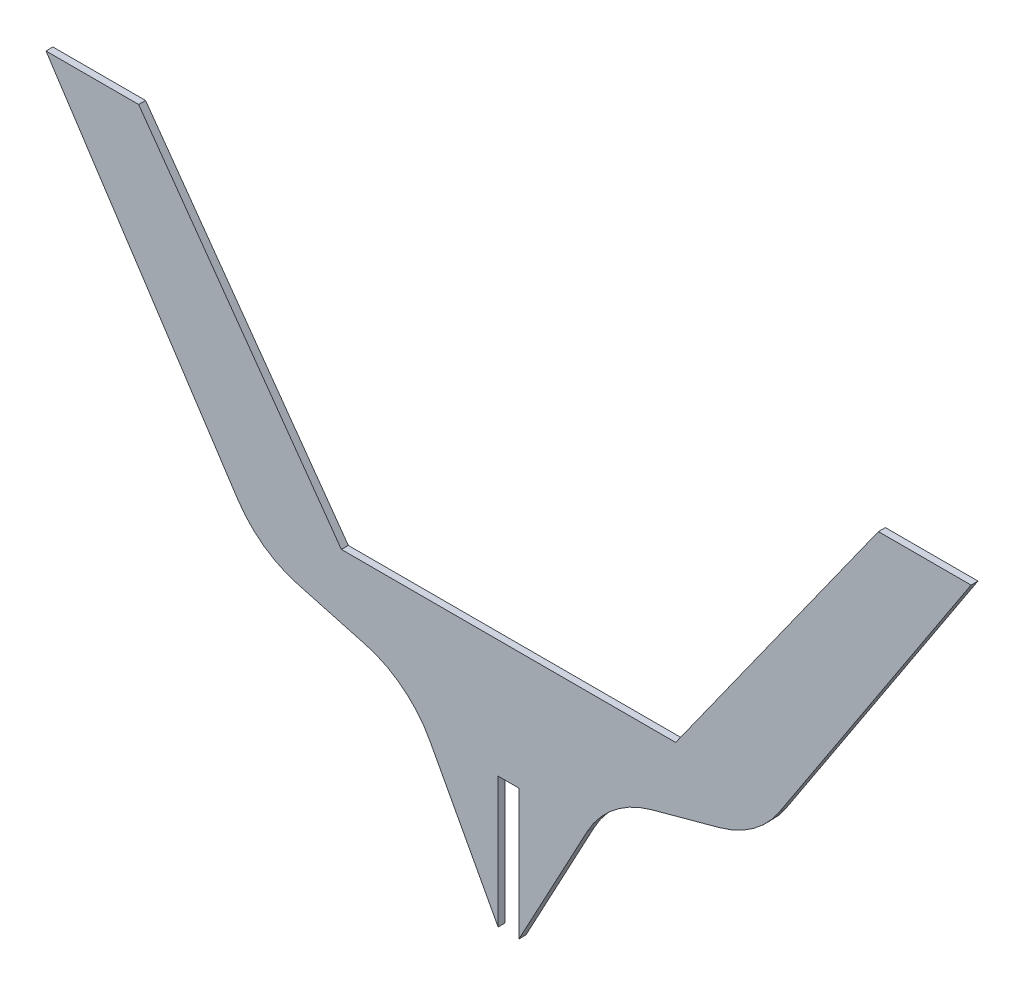
ISO-10303-21;
HEADER;
FILE_DESCRIPTION(('STEP AP214'),'2;1');
FILE_NAME('part.step','',(''),(''),'','','');
FILE_SCHEMA(('AUTOMOTIVE_DESIGN { 1 0 10303 214 1 1 1 1 }'));
ENDSEC;
DATA;
#1=APPLICATION_CONTEXT('core data for automotive mechanical design processes');
#2=APPLICATION_PROTOCOL_DEFINITION('international standard','automotive_design',2000,#1);
#3=PRODUCT_CONTEXT('',#1,'mechanical');
#4=PRODUCT('Part','Part','',(#3));
#5=PRODUCT_RELATED_PRODUCT_CATEGORY('part','',(#4));
#6=PRODUCT_DEFINITION_FORMATION('','',#4);
#7=PRODUCT_DEFINITION_CONTEXT('part definition',#1,'design');
#8=PRODUCT_DEFINITION('design','',#6,#7);
#9=PRODUCT_DEFINITION_SHAPE('','',#8);
#10=(LENGTH_UNIT() NAMED_UNIT(*) SI_UNIT(.MILLI.,.METRE.));
#11=(NAMED_UNIT(*) PLANE_ANGLE_UNIT() SI_UNIT($,.RADIAN.));
#12=(NAMED_UNIT(*) SI_UNIT($,.STERADIAN.) SOLID_ANGLE_UNIT());
#13=UNCERTAINTY_MEASURE_WITH_UNIT(LENGTH_MEASURE(1.E-05),#10,'distance_accuracy_value','');
#14=(GEOMETRIC_REPRESENTATION_CONTEXT(3) GLOBAL_UNCERTAINTY_ASSIGNED_CONTEXT((#13)) GLOBAL_UNIT_ASSIGNED_CONTEXT((#10,
#11,#12)) REPRESENTATION_CONTEXT('',''));
#15=CARTESIAN_POINT('',(0.,0.,0.));
#16=DIRECTION('',(0.,0.,1.));
#17=DIRECTION('',(1.,0.,0.));
#18=AXIS2_PLACEMENT_3D('',#15,#16,#17);
#19=CARTESIAN_POINT('',(209.958428132629,-278.078138889041,3.));
#20=DIRECTION('',(1.,0.,0.));
#21=DIRECTION('',(0.,1.,0.));
#22=AXIS2_PLACEMENT_3D('',#19,#20,#21);
#23=PLANE('',#22);
#24=DIRECTION('',(0.,-1.,0.));
#25=VECTOR('',#24,1.);
#26=CARTESIAN_POINT('',(209.958428132629,-278.078138889041,0.));
#27=LINE('',#26,#25);
#28=CARTESIAN_POINT('',(209.958428132629,-221.578138889041,0.));
#29=VERTEX_POINT('',#28);
#30=CARTESIAN_POINT('',(209.958428132629,-278.078138889041,0.));
#31=VERTEX_POINT('',#30);
#32=EDGE_CURVE('E184',#29,#31,#27,.T.);
#33=ORIENTED_EDGE('',*,*,#32,.T.);
#34=DIRECTION('',(0.,0.,-1.));
#35=VECTOR('',#34,1.);
#36=CARTESIAN_POINT('',(209.958428132629,-278.078138889041,3.));
#37=LINE('',#36,#35);
#38=CARTESIAN_POINT('',(209.958428132629,-278.078138889041,3.));
#39=VERTEX_POINT('',#38);
#40=EDGE_CURVE('E165',#39,#31,#37,.T.);
#41=ORIENTED_EDGE('',*,*,#40,.F.);
#42=DIRECTION('',(0.,-1.,0.));
#43=VECTOR('',#42,1.);
#44=CARTESIAN_POINT('',(209.958428132629,-278.078138889041,3.));
#45=LINE('',#44,#43);
#46=CARTESIAN_POINT('',(209.958428132629,-221.578138889041,3.));
#47=VERTEX_POINT('',#46);
#48=EDGE_CURVE('E171',#47,#39,#45,.T.);
#49=ORIENTED_EDGE('',*,*,#48,.F.);
#50=DIRECTION('',(0.,0.,-1.));
#51=VECTOR('',#50,1.);
#52=CARTESIAN_POINT('',(209.958428132629,-221.578138889041,3.));
#53=LINE('',#52,#51);
#54=EDGE_CURVE('E252',#47,#29,#53,.T.);
#55=ORIENTED_EDGE('',*,*,#54,.T.);
#56=EDGE_LOOP('',(#33,#41,#49,#55));
#57=FACE_BOUND('',#56,.T.);
#58=ADVANCED_FACE('F35',(#57),#23,.F.);
#59=CARTESIAN_POINT('',(248.604786317527,-206.078138889041,3.));
#60=DIRECTION('',(-0.881097998636577,0.472933734045922,0.));
#61=DIRECTION('',(-0.472933734045922,-0.881097998636577,0.));
#62=AXIS2_PLACEMENT_3D('',#59,#60,#61);
#63=PLANE('',#62);
#64=DIRECTION('',(0.472933734045922,0.881097998636577,0.));
#65=VECTOR('',#64,1.);
#66=CARTESIAN_POINT('',(248.604786317527,-206.078138889041,0.));
#67=LINE('',#66,#65);
#68=CARTESIAN_POINT('',(239.44792025117,-223.13781508475,0.));
#69=VERTEX_POINT('',#68);
#70=EDGE_CURVE('E254',#31,#69,#67,.T.);
#71=ORIENTED_EDGE('',*,*,#70,.T.);
#72=DIRECTION('',(0.,0.,-1.));
#73=VECTOR('',#72,1.);
#74=CARTESIAN_POINT('',(239.44792025117,-223.13781508475,3.));
#75=LINE('',#74,#73);
#76=CARTESIAN_POINT('',(239.44792025117,-223.13781508475,3.));
#77=VERTEX_POINT('',#76);
#78=EDGE_CURVE('E168',#69,#77,#75,.F.);
#79=ORIENTED_EDGE('',*,*,#78,.T.);
#80=DIRECTION('',(0.472933734045922,0.881097998636577,0.));
#81=VECTOR('',#80,1.);
#82=CARTESIAN_POINT('',(248.604786317527,-206.078138889041,3.));
#83=LINE('',#82,#81);
#84=EDGE_CURVE('E160',#39,#77,#83,.T.);
#85=ORIENTED_EDGE('',*,*,#84,.F.);
#86=ORIENTED_EDGE('',*,*,#40,.T.);
#87=EDGE_LOOP('',(#71,#79,#85,#86));
#88=FACE_BOUND('',#87,.T.);
#89=ADVANCED_FACE('F163',(#88),#63,.F.);
#90=CARTESIAN_POINT('',(313.167585376123,-188.519568080122,3.));
#91=DIRECTION('',(-0.262429216507242,0.964951245568083,0.));
#92=DIRECTION('',(-0.964951245568083,-0.262429216507242,0.));
#93=AXIS2_PLACEMENT_3D('',#90,#91,#92);
#94=PLANE('',#93);
#95=DIRECTION('',(0.964951245568083,0.262429216507242,0.));
#96=VECTOR('',#95,1.);
#97=CARTESIAN_POINT('',(313.167585376123,-188.519568080122,0.));
#98=LINE('',#97,#96);
#99=CARTESIAN_POINT('',(267.28801544699,-200.997027066253,0.));
#100=VERTEX_POINT('',#99);
#101=CARTESIAN_POINT('',(296.702726457189,-192.997369467335,0.));
#102=VERTEX_POINT('',#101);
#103=EDGE_CURVE('E256',#100,#102,#98,.T.);
#104=ORIENTED_EDGE('',*,*,#103,.T.);
#105=DIRECTION('',(0.,0.,-1.));
#106=VECTOR('',#105,1.);
#107=CARTESIAN_POINT('',(296.702726457189,-192.997369467335,3.));
#108=LINE('',#107,#106);
#109=CARTESIAN_POINT('',(296.702726457189,-192.997369467335,3.));
#110=VERTEX_POINT('',#109);
#111=EDGE_CURVE('E202',#102,#110,#108,.F.);
#112=ORIENTED_EDGE('',*,*,#111,.T.);
#113=DIRECTION('',(0.964951245568083,0.262429216507242,0.));
#114=VECTOR('',#113,1.);
#115=CARTESIAN_POINT('',(313.167585376123,-188.519568080122,3.));
#116=LINE('',#115,#114);
#117=CARTESIAN_POINT('',(267.28801544699,-200.997027066253,3.));
#118=VERTEX_POINT('',#117);
#119=EDGE_CURVE('E170',#118,#110,#116,.T.);
#120=ORIENTED_EDGE('',*,*,#119,.F.);
#121=DIRECTION('',(0.,0.,-1.));
#122=VECTOR('',#121,1.);
#123=CARTESIAN_POINT('',(267.28801544699,-200.997027066253,0.));
#124=LINE('',#123,#122);
#125=EDGE_CURVE('E199',#118,#100,#124,.T.);
#126=ORIENTED_EDGE('',*,*,#125,.T.);
#127=EDGE_LOOP('',(#104,#112,#120,#126));
#128=FACE_BOUND('',#127,.T.);
#129=ADVANCED_FACE('F347',(#128),#94,.F.);
#130=CARTESIAN_POINT('',(405.458428132629,-47.7781388890407,3.));
#131=DIRECTION('',(-0.836240604688809,0.548362700290323,0.));
#132=DIRECTION('',(-0.548362700290323,-0.836240604688809,0.));
#133=AXIS2_PLACEMENT_3D('',#130,#131,#132);
#134=PLANE('',#133);
#135=DIRECTION('',(0.548362700290323,0.836240604688809,0.));
#136=VECTOR('',#135,1.);
#137=CARTESIAN_POINT('',(405.458428132629,-47.7781388890407,3.));
#138=LINE('',#137,#136);
#139=CARTESIAN_POINT('',(322.52423892536,-174.250884929836,3.));
#140=VERTEX_POINT('',#139);
#141=CARTESIAN_POINT('',(405.458428132629,-47.7781388890407,3.));
#142=VERTEX_POINT('',#141);
#143=EDGE_CURVE('E508',#140,#142,#138,.T.);
#144=ORIENTED_EDGE('',*,*,#143,.F.);
#145=DIRECTION('',(0.,0.,-1.));
#146=VECTOR('',#145,1.);
#147=CARTESIAN_POINT('',(322.52423892536,-174.250884929836,3.));
#148=LINE('',#147,#146);
#149=CARTESIAN_POINT('',(322.52423892536,-174.250884929836,0.));
#150=VERTEX_POINT('',#149);
#151=EDGE_CURVE('E185',#140,#150,#148,.T.);
#152=ORIENTED_EDGE('',*,*,#151,.T.);
#153=DIRECTION('',(0.548362700290323,0.836240604688809,0.));
#154=VECTOR('',#153,1.);
#155=CARTESIAN_POINT('',(405.458428132629,-47.7781388890407,0.));
#156=LINE('',#155,#154);
#157=CARTESIAN_POINT('',(405.458428132629,-47.7781388890407,0.));
#158=VERTEX_POINT('',#157);
#159=EDGE_CURVE('E259',#150,#158,#156,.T.);
#160=ORIENTED_EDGE('',*,*,#159,.T.);
#161=DIRECTION('',(0.,0.,-1.));
#162=VECTOR('',#161,1.);
#163=CARTESIAN_POINT('',(405.458428132629,-47.7781388890407,3.));
#164=LINE('',#163,#162);
#165=EDGE_CURVE('E186',#142,#158,#164,.T.);
#166=ORIENTED_EDGE('',*,*,#165,.F.);
#167=EDGE_LOOP('',(#144,#152,#160,#166));
#168=FACE_BOUND('',#167,.T.);
#169=ADVANCED_FACE('F430',(#168),#134,.F.);
#170=CARTESIAN_POINT('',(405.458428132629,-47.7781388890407,3.));
#171=DIRECTION('',(0.,-1.,0.));
#172=DIRECTION('',(1.,0.,0.));
#173=AXIS2_PLACEMENT_3D('',#170,#171,#172);
#174=PLANE('',#173);
#175=DIRECTION('',(-1.,0.,0.));
#176=VECTOR('',#175,1.);
#177=CARTESIAN_POINT('',(405.458428132629,-47.7781388890407,0.));
#178=LINE('',#177,#176);
#179=CARTESIAN_POINT('',(365.406777471685,-47.7781388890407,0.));
#180=VERTEX_POINT('',#179);
#181=EDGE_CURVE('E261',#158,#180,#178,.T.);
#182=ORIENTED_EDGE('',*,*,#181,.T.);
#183=DIRECTION('',(0.,0.,-1.));
#184=VECTOR('',#183,1.);
#185=CARTESIAN_POINT('',(365.406777471685,-47.7781388890407,3.));
#186=LINE('',#185,#184);
#187=CARTESIAN_POINT('',(365.406777471685,-47.7781388890407,3.));
#188=VERTEX_POINT('',#187);
#189=EDGE_CURVE('E192',#188,#180,#186,.T.);
#190=ORIENTED_EDGE('',*,*,#189,.F.);
#191=DIRECTION('',(-1.,0.,0.));
#192=VECTOR('',#191,1.);
#193=CARTESIAN_POINT('',(405.458428132629,-47.7781388890407,3.));
#194=LINE('',#193,#192);
#195=EDGE_CURVE('E506',#142,#188,#194,.T.);
#196=ORIENTED_EDGE('',*,*,#195,.F.);
#197=ORIENTED_EDGE('',*,*,#165,.T.);
#198=EDGE_LOOP('',(#182,#190,#196,#197));
#199=FACE_BOUND('',#198,.T.);
#200=ADVANCED_FACE('F435',(#199),#174,.F.);
#201=CARTESIAN_POINT('',(365.406777471685,-47.7781388890407,3.));
#202=DIRECTION('',(0.813851777248488,-0.581072529611818,0.));
#203=DIRECTION('',(0.581072529611818,0.813851777248488,0.));
#204=AXIS2_PLACEMENT_3D('',#201,#202,#203);
#205=PLANE('',#204);
#206=DIRECTION('',(-0.581072529611818,-0.813851777248488,0.));
#207=VECTOR('',#206,1.);
#208=CARTESIAN_POINT('',(365.406777471685,-47.7781388890407,0.));
#209=LINE('',#208,#207);
#210=CARTESIAN_POINT('',(277.734842334044,-170.571691484358,0.));
#211=VERTEX_POINT('',#210);
#212=EDGE_CURVE('E263',#180,#211,#209,.T.);
#213=ORIENTED_EDGE('',*,*,#212,.T.);
#214=DIRECTION('',(0.,0.,-1.));
#215=VECTOR('',#214,1.);
#216=CARTESIAN_POINT('',(277.734842334044,-170.571691484358,3.));
#217=LINE('',#216,#215);
#218=CARTESIAN_POINT('',(277.734842334044,-170.571691484358,3.));
#219=VERTEX_POINT('',#218);
#220=EDGE_CURVE('E291',#219,#211,#217,.T.);
#221=ORIENTED_EDGE('',*,*,#220,.F.);
#222=DIRECTION('',(-0.581072529611818,-0.813851777248488,0.));
#223=VECTOR('',#222,1.);
#224=CARTESIAN_POINT('',(365.406777471685,-47.7781388890407,3.));
#225=LINE('',#224,#223);
#226=EDGE_CURVE('E300',#188,#219,#225,.T.);
#227=ORIENTED_EDGE('',*,*,#226,.F.);
#228=ORIENTED_EDGE('',*,*,#189,.T.);
#229=EDGE_LOOP('',(#213,#221,#227,#228));
#230=FACE_BOUND('',#229,.T.);
#231=ADVANCED_FACE('F298',(#230),#205,.F.);
#232=CARTESIAN_POINT('',(133.182013931214,-170.571691484358,3.));
#233=DIRECTION('',(0.,-1.,0.));
#234=DIRECTION('',(0.,0.,-1.));
#235=AXIS2_PLACEMENT_3D('',#232,#233,#234);
#236=PLANE('',#235);
#237=DIRECTION('',(-1.,0.,0.));
#238=VECTOR('',#237,1.);
#239=CARTESIAN_POINT('',(133.182013931214,-170.571691484358,0.));
#240=LINE('',#239,#238);
#241=CARTESIAN_POINT('',(133.182013931214,-170.571691484358,0.));
#242=VERTEX_POINT('',#241);
#243=EDGE_CURVE('E265',#211,#242,#240,.T.);
#244=ORIENTED_EDGE('',*,*,#243,.T.);
#245=DIRECTION('',(0.,0.,-1.));
#246=VECTOR('',#245,1.);
#247=CARTESIAN_POINT('',(133.182013931214,-170.571691484358,3.));
#248=LINE('',#247,#246);
#249=CARTESIAN_POINT('',(133.182013931214,-170.571691484358,3.));
#250=VERTEX_POINT('',#249);
#251=EDGE_CURVE('E288',#250,#242,#248,.T.);
#252=ORIENTED_EDGE('',*,*,#251,.F.);
#253=DIRECTION('',(-1.,0.,0.));
#254=VECTOR('',#253,1.);
#255=CARTESIAN_POINT('',(133.182013931214,-170.571691484358,3.));
#256=LINE('',#255,#254);
#257=EDGE_CURVE('E318',#219,#250,#256,.T.);
#258=ORIENTED_EDGE('',*,*,#257,.F.);
#259=ORIENTED_EDGE('',*,*,#220,.T.);
#260=EDGE_LOOP('',(#244,#252,#258,#259));
#261=FACE_BOUND('',#260,.T.);
#262=ADVANCED_FACE('F309',(#261),#236,.F.);
#263=CARTESIAN_POINT('',(45.5100787935732,-47.7781388890407,3.));
#264=DIRECTION('',(-0.813851777248488,-0.581072529611818,0.));
#265=DIRECTION('',(0.581072529611818,-0.813851777248488,0.));
#266=AXIS2_PLACEMENT_3D('',#263,#264,#265);
#267=PLANE('',#266);
#268=DIRECTION('',(-0.581072529611818,0.813851777248488,0.));
#269=VECTOR('',#268,1.);
#270=CARTESIAN_POINT('',(45.5100787935732,-47.7781388890407,0.));
#271=LINE('',#270,#269);
#272=CARTESIAN_POINT('',(45.5100787935732,-47.7781388890407,0.));
#273=VERTEX_POINT('',#272);
#274=EDGE_CURVE('E267',#242,#273,#271,.T.);
#275=ORIENTED_EDGE('',*,*,#274,.T.);
#276=DIRECTION('',(0.,0.,-1.));
#277=VECTOR('',#276,1.);
#278=CARTESIAN_POINT('',(45.5100787935732,-47.7781388890407,3.));
#279=LINE('',#278,#277);
#280=CARTESIAN_POINT('',(45.5100787935732,-47.7781388890407,3.));
#281=VERTEX_POINT('',#280);
#282=EDGE_CURVE('E285',#281,#273,#279,.T.);
#283=ORIENTED_EDGE('',*,*,#282,.F.);
#284=DIRECTION('',(-0.581072529611818,0.813851777248488,0.));
#285=VECTOR('',#284,1.);
#286=CARTESIAN_POINT('',(45.5100787935732,-47.7781388890407,3.));
#287=LINE('',#286,#285);
#288=EDGE_CURVE('E315',#250,#281,#287,.T.);
#289=ORIENTED_EDGE('',*,*,#288,.F.);
#290=ORIENTED_EDGE('',*,*,#251,.T.);
#291=EDGE_LOOP('',(#275,#283,#289,#290));
#292=FACE_BOUND('',#291,.T.);
#293=ADVANCED_FACE('F313',(#292),#267,.F.);
#294=CARTESIAN_POINT('',(5.45842813262881,-47.7781388890407,3.));
#295=DIRECTION('',(0.,-1.,0.));
#296=DIRECTION('',(1.,0.,0.));
#297=AXIS2_PLACEMENT_3D('',#294,#295,#296);
#298=PLANE('',#297);
#299=DIRECTION('',(-1.,0.,0.));
#300=VECTOR('',#299,1.);
#301=CARTESIAN_POINT('',(5.45842813262881,-47.7781388890407,0.));
#302=LINE('',#301,#300);
#303=CARTESIAN_POINT('',(5.45842813262881,-47.7781388890407,0.));
#304=VERTEX_POINT('',#303);
#305=EDGE_CURVE('E269',#273,#304,#302,.T.);
#306=ORIENTED_EDGE('',*,*,#305,.T.);
#307=DIRECTION('',(0.,0.,-1.));
#308=VECTOR('',#307,1.);
#309=CARTESIAN_POINT('',(5.45842813262881,-47.7781388890407,3.));
#310=LINE('',#309,#308);
#311=CARTESIAN_POINT('',(5.45842813262881,-47.7781388890407,3.));
#312=VERTEX_POINT('',#311);
#313=EDGE_CURVE('E282',#312,#304,#310,.T.);
#314=ORIENTED_EDGE('',*,*,#313,.F.);
#315=DIRECTION('',(-1.,0.,0.));
#316=VECTOR('',#315,1.);
#317=CARTESIAN_POINT('',(5.45842813262881,-47.7781388890407,3.));
#318=LINE('',#317,#316);
#319=EDGE_CURVE('E317',#281,#312,#318,.T.);
#320=ORIENTED_EDGE('',*,*,#319,.F.);
#321=ORIENTED_EDGE('',*,*,#282,.T.);
#322=EDGE_LOOP('',(#306,#314,#320,#321));
#323=FACE_BOUND('',#322,.T.);
#324=ADVANCED_FACE('F333',(#323),#298,.F.);
#325=CARTESIAN_POINT('',(5.45842813262881,-47.7781388890407,3.));
#326=DIRECTION('',(0.836240604688809,0.548362700290323,0.));
#327=DIRECTION('',(-0.548362700290323,0.836240604688809,0.));
#328=AXIS2_PLACEMENT_3D('',#325,#326,#327);
#329=PLANE('',#328);
#330=DIRECTION('',(0.548362700290323,-0.836240604688809,0.));
#331=VECTOR('',#330,1.);
#332=CARTESIAN_POINT('',(5.45842813262881,-47.7781388890407,0.));
#333=LINE('',#332,#331);
#334=CARTESIAN_POINT('',(88.3926173398979,-174.250884929836,0.));
#335=VERTEX_POINT('',#334);
#336=EDGE_CURVE('E233',#304,#335,#333,.T.);
#337=ORIENTED_EDGE('',*,*,#336,.T.);
#338=DIRECTION('',(0.,0.,-1.));
#339=VECTOR('',#338,1.);
#340=CARTESIAN_POINT('',(88.3926173398978,-174.250884929836,3.));
#341=LINE('',#340,#339);
#342=CARTESIAN_POINT('',(88.3926173398979,-174.250884929836,3.));
#343=VERTEX_POINT('',#342);
#344=EDGE_CURVE('E216',#335,#343,#341,.F.);
#345=ORIENTED_EDGE('',*,*,#344,.T.);
#346=DIRECTION('',(0.548362700290323,-0.836240604688809,0.));
#347=VECTOR('',#346,1.);
#348=CARTESIAN_POINT('',(5.45842813262881,-47.7781388890407,3.));
#349=LINE('',#348,#347);
#350=EDGE_CURVE('E247',#312,#343,#349,.T.);
#351=ORIENTED_EDGE('',*,*,#350,.F.);
#352=ORIENTED_EDGE('',*,*,#313,.T.);
#353=EDGE_LOOP('',(#337,#345,#351,#352));
#354=FACE_BOUND('',#353,.T.);
#355=ADVANCED_FACE('F331',(#354),#329,.F.);
#356=CARTESIAN_POINT('',(97.749270889135,-188.519568080122,3.));
#357=DIRECTION('',(0.262429216507242,0.964951245568083,0.));
#358=DIRECTION('',(-0.964951245568083,0.262429216507242,0.));
#359=AXIS2_PLACEMENT_3D('',#356,#357,#358);
#360=PLANE('',#359);
#361=DIRECTION('',(0.964951245568083,-0.262429216507242,0.));
#362=VECTOR('',#361,1.);
#363=CARTESIAN_POINT('',(97.749270889135,-188.519568080122,0.));
#364=LINE('',#363,#362);
#365=CARTESIAN_POINT('',(114.214129808068,-192.997369467335,0.));
#366=VERTEX_POINT('',#365);
#367=CARTESIAN_POINT('',(143.628840818268,-200.997027066253,0.));
#368=VERTEX_POINT('',#367);
#369=EDGE_CURVE('E226',#366,#368,#364,.T.);
#370=ORIENTED_EDGE('',*,*,#369,.T.);
#371=DIRECTION('',(0.,0.,-1.));
#372=VECTOR('',#371,1.);
#373=CARTESIAN_POINT('',(143.628840818268,-200.997027066253,3.));
#374=LINE('',#373,#372);
#375=CARTESIAN_POINT('',(143.628840818268,-200.997027066253,3.));
#376=VERTEX_POINT('',#375);
#377=EDGE_CURVE('E56',#368,#376,#374,.F.);
#378=ORIENTED_EDGE('',*,*,#377,.T.);
#379=DIRECTION('',(0.964951245568083,-0.262429216507242,0.));
#380=VECTOR('',#379,1.);
#381=CARTESIAN_POINT('',(97.749270889135,-188.519568080122,3.));
#382=LINE('',#381,#380);
#383=CARTESIAN_POINT('',(114.214129808068,-192.997369467335,3.));
#384=VERTEX_POINT('',#383);
#385=EDGE_CURVE('E244',#384,#376,#382,.T.);
#386=ORIENTED_EDGE('',*,*,#385,.F.);
#387=DIRECTION('',(0.,0.,-1.));
#388=VECTOR('',#387,1.);
#389=CARTESIAN_POINT('',(114.214129808068,-192.997369467335,3.));
#390=LINE('',#389,#388);
#391=EDGE_CURVE('E212',#384,#366,#390,.T.);
#392=ORIENTED_EDGE('',*,*,#391,.T.);
#393=EDGE_LOOP('',(#370,#378,#386,#392));
#394=FACE_BOUND('',#393,.T.);
#395=ADVANCED_FACE('F231',(#394),#360,.F.);
#396=CARTESIAN_POINT('',(162.31206994773,-206.078138889041,3.));
#397=DIRECTION('',(0.881097998636576,0.472933734045923,0.));
#398=DIRECTION('',(-0.472933734045923,0.881097998636576,0.));
#399=AXIS2_PLACEMENT_3D('',#396,#397,#398);
#400=PLANE('',#399);
#401=DIRECTION('',(0.472933734045923,-0.881097998636576,0.));
#402=VECTOR('',#401,1.);
#403=CARTESIAN_POINT('',(162.31206994773,-206.078138889041,3.));
#404=LINE('',#403,#402);
#405=CARTESIAN_POINT('',(171.468936014088,-223.13781508475,3.));
#406=VERTEX_POINT('',#405);
#407=CARTESIAN_POINT('',(200.958428132629,-278.078138889041,3.));
#408=VERTEX_POINT('',#407);
#409=EDGE_CURVE('E240',#406,#408,#404,.T.);
#410=ORIENTED_EDGE('',*,*,#409,.F.);
#411=DIRECTION('',(0.,0.,-1.));
#412=VECTOR('',#411,1.);
#413=CARTESIAN_POINT('',(171.468936014088,-223.13781508475,0.));
#414=LINE('',#413,#412);
#415=CARTESIAN_POINT('',(171.468936014088,-223.13781508475,0.));
#416=VERTEX_POINT('',#415);
#417=EDGE_CURVE('E209',#406,#416,#414,.T.);
#418=ORIENTED_EDGE('',*,*,#417,.T.);
#419=DIRECTION('',(0.472933734045923,-0.881097998636576,0.));
#420=VECTOR('',#419,1.);
#421=CARTESIAN_POINT('',(162.31206994773,-206.078138889041,0.));
#422=LINE('',#421,#420);
#423=CARTESIAN_POINT('',(200.958428132629,-278.078138889041,0.));
#424=VERTEX_POINT('',#423);
#425=EDGE_CURVE('E228',#416,#424,#422,.T.);
#426=ORIENTED_EDGE('',*,*,#425,.T.);
#427=DIRECTION('',(0.,0.,-1.));
#428=VECTOR('',#427,1.);
#429=CARTESIAN_POINT('',(200.958428132629,-278.078138889041,3.));
#430=LINE('',#429,#428);
#431=EDGE_CURVE('E241',#408,#424,#430,.T.);
#432=ORIENTED_EDGE('',*,*,#431,.F.);
#433=EDGE_LOOP('',(#410,#418,#426,#432));
#434=FACE_BOUND('',#433,.T.);
#435=ADVANCED_FACE('F237',(#434),#400,.F.);
#436=CARTESIAN_POINT('',(200.958428132629,-278.078138889041,3.));
#437=DIRECTION('',(-1.,0.,0.));
#438=DIRECTION('',(0.,-1.,0.));
#439=AXIS2_PLACEMENT_3D('',#436,#437,#438);
#440=PLANE('',#439);
#441=DIRECTION('',(0.,1.,0.));
#442=VECTOR('',#441,1.);
#443=CARTESIAN_POINT('',(200.958428132629,-278.078138889041,0.));
#444=LINE('',#443,#442);
#445=CARTESIAN_POINT('',(200.958428132629,-221.578138889041,0.));
#446=VERTEX_POINT('',#445);
#447=EDGE_CURVE('E274',#424,#446,#444,.T.);
#448=ORIENTED_EDGE('',*,*,#447,.T.);
#449=DIRECTION('',(0.,0.,-1.));
#450=VECTOR('',#449,1.);
#451=CARTESIAN_POINT('',(200.958428132629,-221.578138889041,3.));
#452=LINE('',#451,#450);
#453=CARTESIAN_POINT('',(200.958428132629,-221.578138889041,3.));
#454=VERTEX_POINT('',#453);
#455=EDGE_CURVE('E278',#454,#446,#452,.T.);
#456=ORIENTED_EDGE('',*,*,#455,.F.);
#457=DIRECTION('',(0.,1.,0.));
#458=VECTOR('',#457,1.);
#459=CARTESIAN_POINT('',(200.958428132629,-278.078138889041,3.));
#460=LINE('',#459,#458);
#461=EDGE_CURVE('E243',#408,#454,#460,.T.);
#462=ORIENTED_EDGE('',*,*,#461,.F.);
#463=ORIENTED_EDGE('',*,*,#431,.T.);
#464=EDGE_LOOP('',(#448,#456,#462,#463));
#465=FACE_BOUND('',#464,.T.);
#466=ADVANCED_FACE('F408',(#465),#440,.F.);
#467=CARTESIAN_POINT('',(200.958428132629,-221.578138889041,3.));
#468=DIRECTION('',(0.,1.,0.));
#469=DIRECTION('',(0.,0.,1.));
#470=AXIS2_PLACEMENT_3D('',#467,#468,#469);
#471=PLANE('',#470);
#472=DIRECTION('',(1.,0.,0.));
#473=VECTOR('',#472,1.);
#474=CARTESIAN_POINT('',(200.958428132629,-221.578138889041,0.));
#475=LINE('',#474,#473);
#476=EDGE_CURVE('E181',#446,#29,#475,.T.);
#477=ORIENTED_EDGE('',*,*,#476,.T.);
#478=ORIENTED_EDGE('',*,*,#54,.F.);
#479=DIRECTION('',(1.,0.,0.));
#480=VECTOR('',#479,1.);
#481=CARTESIAN_POINT('',(200.958428132629,-221.578138889041,3.));
#482=LINE('',#481,#480);
#483=EDGE_CURVE('E177',#454,#47,#482,.T.);
#484=ORIENTED_EDGE('',*,*,#483,.F.);
#485=ORIENTED_EDGE('',*,*,#455,.T.);
#486=EDGE_LOOP('',(#477,#478,#484,#485));
#487=FACE_BOUND('',#486,.T.);
#488=ADVANCED_FACE('F397',(#487),#471,.F.);
#489=CARTESIAN_POINT('',(0.,0.,3.));
#490=DIRECTION('',(0.,0.,-1.));
#491=DIRECTION('',(-1.,0.,0.));
#492=AXIS2_PLACEMENT_3D('',#489,#490,#491);
#493=PLANE('',#492);
#494=ORIENTED_EDGE('',*,*,#119,.T.);
#495=CARTESIAN_POINT('',(284.893411714363,-149.574563416771,3.));
#496=DIRECTION('',(0.,0.,-1.));
#497=DIRECTION('',(-1.,0.,0.));
#498=AXIS2_PLACEMENT_3D('',#495,#496,#497);
#499=CIRCLE('',#498,45.);
#500=EDGE_CURVE('E206',#110,#140,#499,.F.);
#501=ORIENTED_EDGE('',*,*,#500,.T.);
#502=ORIENTED_EDGE('',*,*,#143,.T.);
#503=ORIENTED_EDGE('',*,*,#195,.T.);
#504=ORIENTED_EDGE('',*,*,#226,.T.);
#505=ORIENTED_EDGE('',*,*,#257,.T.);
#506=ORIENTED_EDGE('',*,*,#288,.T.);
#507=ORIENTED_EDGE('',*,*,#319,.T.);
#508=ORIENTED_EDGE('',*,*,#350,.T.);
#509=CARTESIAN_POINT('',(126.023444550894,-149.574563416771,3.));
#510=DIRECTION('',(0.,0.,-1.));
#511=DIRECTION('',(-1.,0.,0.));
#512=AXIS2_PLACEMENT_3D('',#509,#510,#511);
#513=CIRCLE('',#512,45.);
#514=EDGE_CURVE('E204',#343,#384,#513,.F.);
#515=ORIENTED_EDGE('',*,*,#514,.T.);
#516=ORIENTED_EDGE('',*,*,#385,.T.);
#517=CARTESIAN_POINT('',(131.819526075442,-244.419833116816,3.));
#518=DIRECTION('',(0.,0.,-1.));
#519=DIRECTION('',(-1.,0.,0.));
#520=AXIS2_PLACEMENT_3D('',#517,#518,#519);
#521=CIRCLE('',#520,45.);
#522=EDGE_CURVE('E11',#376,#406,#521,.T.);
#523=ORIENTED_EDGE('',*,*,#522,.T.);
#524=ORIENTED_EDGE('',*,*,#409,.T.);
#525=ORIENTED_EDGE('',*,*,#461,.T.);
#526=ORIENTED_EDGE('',*,*,#483,.T.);
#527=ORIENTED_EDGE('',*,*,#48,.T.);
#528=ORIENTED_EDGE('',*,*,#84,.T.);
#529=CARTESIAN_POINT('',(279.097330189816,-244.419833116816,3.));
#530=DIRECTION('',(0.,0.,-1.));
#531=DIRECTION('',(-1.,0.,0.));
#532=AXIS2_PLACEMENT_3D('',#529,#530,#531);
#533=CIRCLE('',#532,45.);
#534=EDGE_CURVE('E220',#77,#118,#533,.T.);
#535=ORIENTED_EDGE('',*,*,#534,.T.);
#536=EDGE_LOOP('',(#494,#501,#502,#503,#504,#505,#506,#507,#508,#515,#516,#523,#524,#525,#526,
#527,#528,#535));
#537=FACE_BOUND('',#536,.T.);
#538=ADVANCED_FACE('F175',(#537),#493,.F.);
#539=CARTESIAN_POINT('',(0.,0.,0.));
#540=DIRECTION('',(0.,0.,-1.));
#541=DIRECTION('',(-1.,0.,0.));
#542=AXIS2_PLACEMENT_3D('',#539,#540,#541);
#543=PLANE('',#542);
#544=ORIENTED_EDGE('',*,*,#159,.F.);
#545=CARTESIAN_POINT('',(284.893411714363,-149.574563416771,0.));
#546=DIRECTION('',(0.,0.,-1.));
#547=DIRECTION('',(-1.,0.,0.));
#548=AXIS2_PLACEMENT_3D('',#545,#546,#547);
#549=CIRCLE('',#548,45.);
#550=EDGE_CURVE('E197',#150,#102,#549,.T.);
#551=ORIENTED_EDGE('',*,*,#550,.T.);
#552=ORIENTED_EDGE('',*,*,#103,.F.);
#553=CARTESIAN_POINT('',(279.097330189816,-244.419833116816,0.));
#554=DIRECTION('',(0.,0.,-1.));
#555=DIRECTION('',(-1.,0.,0.));
#556=AXIS2_PLACEMENT_3D('',#553,#554,#555);
#557=CIRCLE('',#556,45.);
#558=EDGE_CURVE('E218',#100,#69,#557,.F.);
#559=ORIENTED_EDGE('',*,*,#558,.T.);
#560=ORIENTED_EDGE('',*,*,#70,.F.);
#561=ORIENTED_EDGE('',*,*,#32,.F.);
#562=ORIENTED_EDGE('',*,*,#476,.F.);
#563=ORIENTED_EDGE('',*,*,#447,.F.);
#564=ORIENTED_EDGE('',*,*,#425,.F.);
#565=CARTESIAN_POINT('',(131.819526075442,-244.419833116816,0.));
#566=DIRECTION('',(0.,0.,-1.));
#567=DIRECTION('',(-1.,0.,0.));
#568=AXIS2_PLACEMENT_3D('',#565,#566,#567);
#569=CIRCLE('',#568,45.);
#570=EDGE_CURVE('E43',#416,#368,#569,.F.);
#571=ORIENTED_EDGE('',*,*,#570,.T.);
#572=ORIENTED_EDGE('',*,*,#369,.F.);
#573=CARTESIAN_POINT('',(126.023444550894,-149.574563416771,0.));
#574=DIRECTION('',(0.,0.,-1.));
#575=DIRECTION('',(-1.,0.,0.));
#576=AXIS2_PLACEMENT_3D('',#573,#574,#575);
#577=CIRCLE('',#576,45.);
#578=EDGE_CURVE('E189',#366,#335,#577,.T.);
#579=ORIENTED_EDGE('',*,*,#578,.T.);
#580=ORIENTED_EDGE('',*,*,#336,.F.);
#581=ORIENTED_EDGE('',*,*,#305,.F.);
#582=ORIENTED_EDGE('',*,*,#274,.F.);
#583=ORIENTED_EDGE('',*,*,#243,.F.);
#584=ORIENTED_EDGE('',*,*,#212,.F.);
#585=ORIENTED_EDGE('',*,*,#181,.F.);
#586=EDGE_LOOP('',(#544,#551,#552,#559,#560,#561,#562,#563,#564,#571,#572,#579,#580,#581,#582,
#583,#584,#585));
#587=FACE_BOUND('',#586,.T.);
#588=ADVANCED_FACE('F225',(#587),#543,.T.);
#589=CARTESIAN_POINT('',(284.893411714363,-149.574563416771,3.));
#590=DIRECTION('',(0.,0.,-1.));
#591=DIRECTION('',(-1.,0.,0.));
#592=AXIS2_PLACEMENT_3D('',#589,#590,#591);
#593=CYLINDRICAL_SURFACE('',#592,45.);
#594=ORIENTED_EDGE('',*,*,#500,.F.);
#595=ORIENTED_EDGE('',*,*,#111,.F.);
#596=ORIENTED_EDGE('',*,*,#550,.F.);
#597=ORIENTED_EDGE('',*,*,#151,.F.);
#598=EDGE_LOOP('',(#594,#595,#596,#597));
#599=FACE_BOUND('',#598,.T.);
#600=ADVANCED_FACE('F351',(#599),#593,.T.);
#601=CARTESIAN_POINT('',(279.097330189816,-244.419833116816,3.));
#602=DIRECTION('',(0.,0.,1.));
#603=DIRECTION('',(1.,0.,0.));
#604=AXIS2_PLACEMENT_3D('',#601,#602,#603);
#605=CYLINDRICAL_SURFACE('',#604,45.);
#606=ORIENTED_EDGE('',*,*,#534,.F.);
#607=ORIENTED_EDGE('',*,*,#78,.F.);
#608=ORIENTED_EDGE('',*,*,#558,.F.);
#609=ORIENTED_EDGE('',*,*,#125,.F.);
#610=EDGE_LOOP('',(#606,#607,#608,#609));
#611=FACE_BOUND('',#610,.T.);
#612=ADVANCED_FACE('F354',(#611),#605,.F.);
#613=CARTESIAN_POINT('',(131.819526075442,-244.419833116816,3.));
#614=DIRECTION('',(0.,0.,1.));
#615=DIRECTION('',(1.,0.,0.));
#616=AXIS2_PLACEMENT_3D('',#613,#614,#615);
#617=CYLINDRICAL_SURFACE('',#616,45.);
#618=ORIENTED_EDGE('',*,*,#522,.F.);
#619=ORIENTED_EDGE('',*,*,#377,.F.);
#620=ORIENTED_EDGE('',*,*,#570,.F.);
#621=ORIENTED_EDGE('',*,*,#417,.F.);
#622=EDGE_LOOP('',(#618,#619,#620,#621));
#623=FACE_BOUND('',#622,.T.);
#624=ADVANCED_FACE('F235',(#623),#617,.F.);
#625=CARTESIAN_POINT('',(126.023444550894,-149.574563416771,3.));
#626=DIRECTION('',(0.,0.,-1.));
#627=DIRECTION('',(-1.,0.,0.));
#628=AXIS2_PLACEMENT_3D('',#625,#626,#627);
#629=CYLINDRICAL_SURFACE('',#628,45.);
#630=ORIENTED_EDGE('',*,*,#514,.F.);
#631=ORIENTED_EDGE('',*,*,#344,.F.);
#632=ORIENTED_EDGE('',*,*,#578,.F.);
#633=ORIENTED_EDGE('',*,*,#391,.F.);
#634=EDGE_LOOP('',(#630,#631,#632,#633));
#635=FACE_BOUND('',#634,.T.);
#636=ADVANCED_FACE('F37',(#635),#629,.T.);
#637=CLOSED_SHELL('',(#58,#89,#129,#169,#200,#231,#262,#293,#324,#355,#395,#435,#466,#488,#538,
#588,#600,#612,#624,#636));
#638=MANIFOLD_SOLID_BREP('B2',#637);
#639=ADVANCED_BREP_SHAPE_REPRESENTATION('',(#18,#638),#14);
#640=SHAPE_DEFINITION_REPRESENTATION(#9,#639);
ENDSEC;
END-ISO-10303-21;
